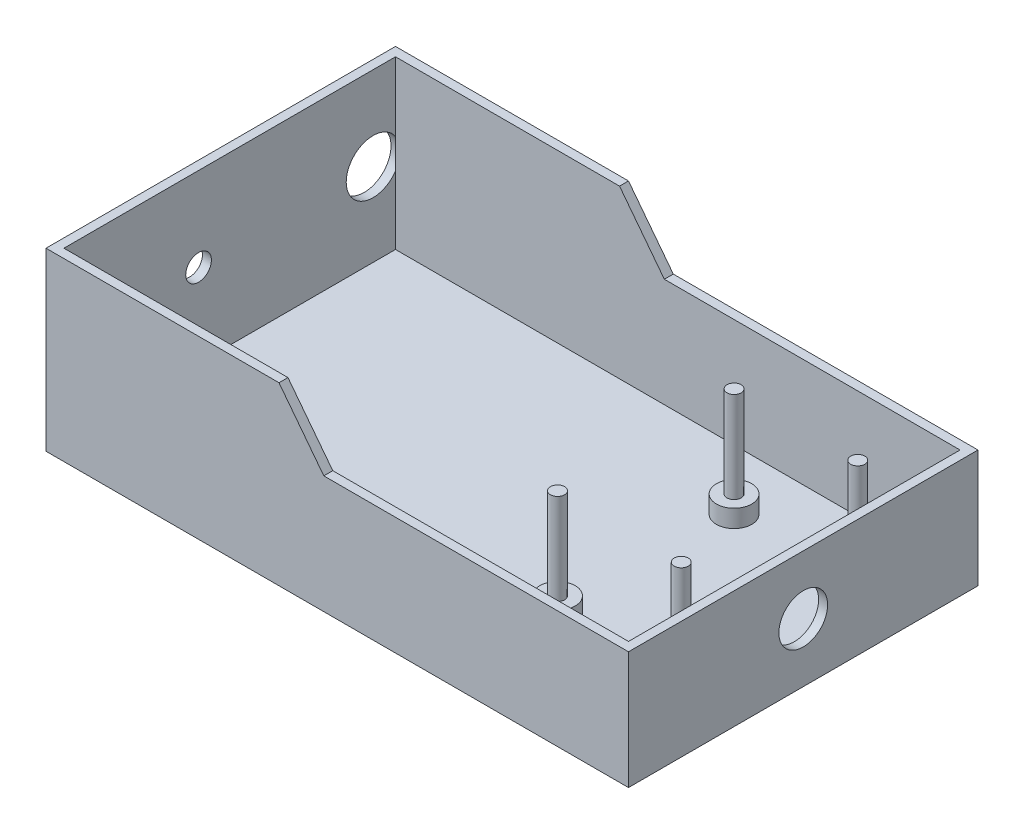
ISO-10303-21;
HEADER;
FILE_DESCRIPTION(('STEP AP214'),'2;1');
FILE_NAME('part.step','',(''),(''),'','','');
FILE_SCHEMA(('AUTOMOTIVE_DESIGN { 1 0 10303 214 1 1 1 1 }'));
ENDSEC;
DATA;
#1=APPLICATION_CONTEXT('core data for automotive mechanical design processes');
#2=APPLICATION_PROTOCOL_DEFINITION('international standard','automotive_design',2000,#1);
#3=PRODUCT_CONTEXT('',#1,'mechanical');
#4=PRODUCT('Part','Part','',(#3));
#5=PRODUCT_RELATED_PRODUCT_CATEGORY('part','',(#4));
#6=PRODUCT_DEFINITION_FORMATION('','',#4);
#7=PRODUCT_DEFINITION_CONTEXT('part definition',#1,'design');
#8=PRODUCT_DEFINITION('design','',#6,#7);
#9=PRODUCT_DEFINITION_SHAPE('','',#8);
#10=(LENGTH_UNIT() NAMED_UNIT(*) SI_UNIT(.MILLI.,.METRE.));
#11=(NAMED_UNIT(*) PLANE_ANGLE_UNIT() SI_UNIT($,.RADIAN.));
#12=(NAMED_UNIT(*) SI_UNIT($,.STERADIAN.) SOLID_ANGLE_UNIT());
#13=UNCERTAINTY_MEASURE_WITH_UNIT(LENGTH_MEASURE(1.E-05),#10,'distance_accuracy_value','');
#14=(GEOMETRIC_REPRESENTATION_CONTEXT(3) GLOBAL_UNCERTAINTY_ASSIGNED_CONTEXT((#13)) GLOBAL_UNIT_ASSIGNED_CONTEXT((#10,
#11,#12)) REPRESENTATION_CONTEXT('',''));
#15=CARTESIAN_POINT('',(0.,0.,0.));
#16=DIRECTION('',(0.,0.,1.));
#17=DIRECTION('',(1.,0.,0.));
#18=AXIS2_PLACEMENT_3D('',#15,#16,#17);
#19=CARTESIAN_POINT('',(0.,0.,2.54));
#20=DIRECTION('',(0.,0.,-1.));
#21=DIRECTION('',(-1.,0.,0.));
#22=AXIS2_PLACEMENT_3D('',#19,#20,#21);
#23=PLANE('',#22);
#24=DIRECTION('',(1.,0.,0.));
#25=VECTOR('',#24,1.);
#26=CARTESIAN_POINT('',(152.4,0.,2.54));
#27=LINE('',#26,#25);
#28=CARTESIAN_POINT('',(0.,0.,2.54));
#29=VERTEX_POINT('',#28);
#30=CARTESIAN_POINT('',(160.02,0.,2.53999999999997));
#31=VERTEX_POINT('',#30);
#32=EDGE_CURVE('E303',#29,#31,#27,.T.);
#33=ORIENTED_EDGE('',*,*,#32,.T.);
#34=DIRECTION('',(0.,-1.,0.));
#35=VECTOR('',#34,1.);
#36=CARTESIAN_POINT('',(160.02,30.7975,2.53999999999997));
#37=LINE('',#36,#35);
#38=CARTESIAN_POINT('',(160.02,30.7975,2.53999999999997));
#39=VERTEX_POINT('',#38);
#40=EDGE_CURVE('E253',#39,#31,#37,.T.);
#41=ORIENTED_EDGE('',*,*,#40,.F.);
#42=DIRECTION('',(1.,0.,0.));
#43=VECTOR('',#42,1.);
#44=CARTESIAN_POINT('',(152.4,30.7975,2.53999999999997));
#45=LINE('',#44,#43);
#46=CARTESIAN_POINT('',(76.2,30.7975,2.53999999999997));
#47=VERTEX_POINT('',#46);
#48=EDGE_CURVE('E287',#47,#39,#45,.T.);
#49=ORIENTED_EDGE('',*,*,#48,.F.);
#50=DIRECTION('',(0.609710760849693,-0.7926239891046,0.));
#51=VECTOR('',#50,1.);
#52=CARTESIAN_POINT('',(76.2,30.7975,2.53999999999997));
#53=LINE('',#52,#51);
#54=CARTESIAN_POINT('',(63.5,47.3075,2.53999999999997));
#55=VERTEX_POINT('',#54);
#56=EDGE_CURVE('E283',#55,#47,#53,.T.);
#57=ORIENTED_EDGE('',*,*,#56,.F.);
#58=DIRECTION('',(1.,0.,0.));
#59=VECTOR('',#58,1.);
#60=CARTESIAN_POINT('',(0.,47.3075,2.53999999999997));
#61=LINE('',#60,#59);
#62=CARTESIAN_POINT('',(0.,47.3075,2.53999999999998));
#63=VERTEX_POINT('',#62);
#64=EDGE_CURVE('E280',#63,#55,#61,.T.);
#65=ORIENTED_EDGE('',*,*,#64,.F.);
#66=DIRECTION('',(0.,-1.,0.));
#67=VECTOR('',#66,1.);
#68=CARTESIAN_POINT('',(0.,0.,2.54));
#69=LINE('',#68,#67);
#70=CARTESIAN_POINT('',(0.,27.7305974918157,2.54));
#71=VERTEX_POINT('',#70);
#72=EDGE_CURVE('E150',#63,#71,#69,.T.);
#73=ORIENTED_EDGE('',*,*,#72,.T.);
#74=CARTESIAN_POINT('',(0.,19.3063705243129,2.54));
#75=VERTEX_POINT('',#74);
#76=EDGE_CURVE('E142',#71,#75,#69,.T.);
#77=ORIENTED_EDGE('',*,*,#76,.T.);
#78=EDGE_CURVE('E60',#75,#29,#69,.T.);
#79=ORIENTED_EDGE('',*,*,#78,.T.);
#80=EDGE_LOOP('',(#33,#41,#49,#57,#65,#73,#77,#79));
#81=FACE_BOUND('',#80,.T.);
#82=ADVANCED_FACE('F38',(#81),#23,.F.);
#83=CARTESIAN_POINT('',(0.,0.,96.52));
#84=DIRECTION('',(0.,0.,-1.));
#85=DIRECTION('',(-1.,0.,0.));
#86=AXIS2_PLACEMENT_3D('',#83,#84,#85);
#87=PLANE('',#86);
#88=DIRECTION('',(0.,-1.,0.));
#89=VECTOR('',#88,1.);
#90=CARTESIAN_POINT('',(160.02,0.,96.52));
#91=LINE('',#90,#89);
#92=CARTESIAN_POINT('',(160.02,30.7975,96.52));
#93=VERTEX_POINT('',#92);
#94=CARTESIAN_POINT('',(160.02,0.,96.52));
#95=VERTEX_POINT('',#94);
#96=EDGE_CURVE('E255',#93,#95,#91,.T.);
#97=ORIENTED_EDGE('',*,*,#96,.T.);
#98=DIRECTION('',(-1.,0.,0.));
#99=VECTOR('',#98,1.);
#100=CARTESIAN_POINT('',(152.4,0.,96.52));
#101=LINE('',#100,#99);
#102=CARTESIAN_POINT('',(0.,0.,96.52));
#103=VERTEX_POINT('',#102);
#104=EDGE_CURVE('E306',#95,#103,#101,.T.);
#105=ORIENTED_EDGE('',*,*,#104,.T.);
#106=DIRECTION('',(0.,-1.,0.));
#107=VECTOR('',#106,1.);
#108=CARTESIAN_POINT('',(0.,0.,96.52));
#109=LINE('',#108,#107);
#110=CARTESIAN_POINT('',(0.,47.3075,96.52));
#111=VERTEX_POINT('',#110);
#112=EDGE_CURVE('E299',#111,#103,#109,.T.);
#113=ORIENTED_EDGE('',*,*,#112,.F.);
#114=DIRECTION('',(-1.,0.,0.));
#115=VECTOR('',#114,1.);
#116=CARTESIAN_POINT('',(0.,47.3075,96.52));
#117=LINE('',#116,#115);
#118=CARTESIAN_POINT('',(63.5,47.3075,96.52));
#119=VERTEX_POINT('',#118);
#120=EDGE_CURVE('E266',#119,#111,#117,.T.);
#121=ORIENTED_EDGE('',*,*,#120,.F.);
#122=DIRECTION('',(-0.609710760849693,0.7926239891046,0.));
#123=VECTOR('',#122,1.);
#124=CARTESIAN_POINT('',(63.5,47.3075,96.52));
#125=LINE('',#124,#123);
#126=CARTESIAN_POINT('',(76.2,30.7975,96.52));
#127=VERTEX_POINT('',#126);
#128=EDGE_CURVE('E262',#127,#119,#125,.T.);
#129=ORIENTED_EDGE('',*,*,#128,.F.);
#130=DIRECTION('',(-1.,0.,0.));
#131=VECTOR('',#130,1.);
#132=CARTESIAN_POINT('',(76.2,30.7975,96.52));
#133=LINE('',#132,#131);
#134=EDGE_CURVE('E259',#93,#127,#133,.T.);
#135=ORIENTED_EDGE('',*,*,#134,.F.);
#136=EDGE_LOOP('',(#97,#105,#113,#121,#129,#135));
#137=FACE_BOUND('',#136,.T.);
#138=ADVANCED_FACE('F343',(#137),#87,.T.);
#139=CARTESIAN_POINT('',(0.,0.,0.));
#140=DIRECTION('',(0.,0.,-1.));
#141=DIRECTION('',(-1.,0.,0.));
#142=AXIS2_PLACEMENT_3D('',#139,#140,#141);
#143=PLANE('',#142);
#144=DIRECTION('',(-1.,0.,0.));
#145=VECTOR('',#144,1.);
#146=CARTESIAN_POINT('',(152.4,-2.54,0.));
#147=LINE('',#146,#145);
#148=CARTESIAN_POINT('',(162.56,-2.54,0.));
#149=VERTEX_POINT('',#148);
#150=CARTESIAN_POINT('',(-2.54,-2.54,0.));
#151=VERTEX_POINT('',#150);
#152=EDGE_CURVE('E148',#149,#151,#147,.T.);
#153=ORIENTED_EDGE('',*,*,#152,.T.);
#154=DIRECTION('',(0.,-1.,0.));
#155=VECTOR('',#154,1.);
#156=CARTESIAN_POINT('',(-2.54,47.3075,0.));
#157=LINE('',#156,#155);
#158=CARTESIAN_POINT('',(-2.54,47.3075,0.));
#159=VERTEX_POINT('',#158);
#160=EDGE_CURVE('E222',#159,#151,#157,.T.);
#161=ORIENTED_EDGE('',*,*,#160,.F.);
#162=DIRECTION('',(1.,0.,0.));
#163=VECTOR('',#162,1.);
#164=CARTESIAN_POINT('',(0.,47.3075,0.));
#165=LINE('',#164,#163);
#166=CARTESIAN_POINT('',(63.5,47.3075,0.));
#167=VERTEX_POINT('',#166);
#168=EDGE_CURVE('E278',#159,#167,#165,.T.);
#169=ORIENTED_EDGE('',*,*,#168,.T.);
#170=DIRECTION('',(0.609710760849693,-0.7926239891046,0.));
#171=VECTOR('',#170,1.);
#172=CARTESIAN_POINT('',(76.2,30.7975,0.));
#173=LINE('',#172,#171);
#174=CARTESIAN_POINT('',(76.2,30.7975,0.));
#175=VERTEX_POINT('',#174);
#176=EDGE_CURVE('E293',#167,#175,#173,.T.);
#177=ORIENTED_EDGE('',*,*,#176,.T.);
#178=DIRECTION('',(1.,0.,0.));
#179=VECTOR('',#178,1.);
#180=CARTESIAN_POINT('',(152.4,30.7975,0.));
#181=LINE('',#180,#179);
#182=CARTESIAN_POINT('',(162.56,30.7975,0.));
#183=VERTEX_POINT('',#182);
#184=EDGE_CURVE('E284',#175,#183,#181,.T.);
#185=ORIENTED_EDGE('',*,*,#184,.T.);
#186=DIRECTION('',(0.,-1.,0.));
#187=VECTOR('',#186,1.);
#188=CARTESIAN_POINT('',(162.56,30.7975,0.));
#189=LINE('',#188,#187);
#190=EDGE_CURVE('E237',#183,#149,#189,.T.);
#191=ORIENTED_EDGE('',*,*,#190,.T.);
#192=EDGE_LOOP('',(#153,#161,#169,#177,#185,#191));
#193=FACE_BOUND('',#192,.T.);
#194=ADVANCED_FACE('F40',(#193),#143,.T.);
#195=CARTESIAN_POINT('',(152.4,-2.54,0.));
#196=DIRECTION('',(0.,1.,0.));
#197=DIRECTION('',(0.,0.,1.));
#198=AXIS2_PLACEMENT_3D('',#195,#196,#197);
#199=PLANE('',#198);
#200=ORIENTED_EDGE('',*,*,#152,.F.);
#201=DIRECTION('',(0.,0.,1.));
#202=VECTOR('',#201,1.);
#203=CARTESIAN_POINT('',(162.56,-2.54,0.));
#204=LINE('',#203,#202);
#205=CARTESIAN_POINT('',(162.56,-2.54,99.06));
#206=VERTEX_POINT('',#205);
#207=EDGE_CURVE('E240',#149,#206,#204,.T.);
#208=ORIENTED_EDGE('',*,*,#207,.T.);
#209=DIRECTION('',(1.,0.,0.));
#210=VECTOR('',#209,1.);
#211=CARTESIAN_POINT('',(152.4,-2.54,99.06));
#212=LINE('',#211,#210);
#213=CARTESIAN_POINT('',(-2.54,-2.54,99.06));
#214=VERTEX_POINT('',#213);
#215=EDGE_CURVE('E301',#214,#206,#212,.T.);
#216=ORIENTED_EDGE('',*,*,#215,.F.);
#217=DIRECTION('',(0.,0.,1.));
#218=VECTOR('',#217,1.);
#219=CARTESIAN_POINT('',(-2.54,-2.54,0.));
#220=LINE('',#219,#218);
#221=EDGE_CURVE('E225',#151,#214,#220,.T.);
#222=ORIENTED_EDGE('',*,*,#221,.F.);
#223=EDGE_LOOP('',(#200,#208,#216,#222));
#224=FACE_BOUND('',#223,.T.);
#225=ADVANCED_FACE('F314',(#224),#199,.F.);
#226=CARTESIAN_POINT('',(0.,0.,0.));
#227=DIRECTION('',(0.,-1.,0.));
#228=DIRECTION('',(0.,0.,-1.));
#229=AXIS2_PLACEMENT_3D('',#226,#227,#228);
#230=PLANE('',#229);
#231=CARTESIAN_POINT('',(148.02,0.,69.5782424781664));
#232=DIRECTION('',(0.,-1.,0.));
#233=DIRECTION('',(0.,0.,-1.));
#234=AXIS2_PLACEMENT_3D('',#231,#232,#233);
#235=CIRCLE('',#234,4.99999999999999);
#236=CARTESIAN_POINT('',(148.02,0.,64.5782424781664));
#237=VERTEX_POINT('',#236);
#238=EDGE_CURVE('E12',#237,#237,#235,.F.);
#239=ORIENTED_EDGE('',*,*,#238,.F.);
#240=EDGE_LOOP('',(#239));
#241=FACE_BOUND('',#240,.T.);
#242=CARTESIAN_POINT('',(112.968000000001,0.,69.5782424781664));
#243=DIRECTION('',(0.,-1.,0.));
#244=DIRECTION('',(0.,0.,-1.));
#245=AXIS2_PLACEMENT_3D('',#242,#243,#244);
#246=CIRCLE('',#245,5.00000000000001);
#247=CARTESIAN_POINT('',(112.968000000001,0.,64.5782424781664));
#248=VERTEX_POINT('',#247);
#249=EDGE_CURVE('E46',#248,#248,#246,.F.);
#250=ORIENTED_EDGE('',*,*,#249,.F.);
#251=EDGE_LOOP('',(#250));
#252=FACE_BOUND('',#251,.T.);
#253=CARTESIAN_POINT('',(148.02,0.,19.5402424781664));
#254=DIRECTION('',(0.,-1.,0.));
#255=DIRECTION('',(0.,0.,-1.));
#256=AXIS2_PLACEMENT_3D('',#253,#254,#255);
#257=CIRCLE('',#256,4.99999999999999);
#258=CARTESIAN_POINT('',(148.02,0.,14.5402424781664));
#259=VERTEX_POINT('',#258);
#260=EDGE_CURVE('E163',#259,#259,#257,.F.);
#261=ORIENTED_EDGE('',*,*,#260,.F.);
#262=EDGE_LOOP('',(#261));
#263=FACE_BOUND('',#262,.T.);
#264=CARTESIAN_POINT('',(112.968,0.,19.5402424781664));
#265=DIRECTION('',(0.,-1.,0.));
#266=DIRECTION('',(0.,0.,-1.));
#267=AXIS2_PLACEMENT_3D('',#264,#265,#266);
#268=CIRCLE('',#267,5.);
#269=CARTESIAN_POINT('',(112.968,0.,14.5402424781664));
#270=VERTEX_POINT('',#269);
#271=EDGE_CURVE('E152',#270,#270,#268,.F.);
#272=ORIENTED_EDGE('',*,*,#271,.F.);
#273=EDGE_LOOP('',(#272));
#274=FACE_BOUND('',#273,.T.);
#275=ORIENTED_EDGE('',*,*,#32,.F.);
#276=DIRECTION('',(0.,0.,-1.));
#277=VECTOR('',#276,1.);
#278=CARTESIAN_POINT('',(0.,0.,96.52));
#279=LINE('',#278,#277);
#280=EDGE_CURVE('E146',#103,#29,#279,.T.);
#281=ORIENTED_EDGE('',*,*,#280,.F.);
#282=ORIENTED_EDGE('',*,*,#104,.F.);
#283=DIRECTION('',(0.,0.,1.));
#284=VECTOR('',#283,1.);
#285=CARTESIAN_POINT('',(160.02,0.,96.52));
#286=LINE('',#285,#284);
#287=EDGE_CURVE('E246',#31,#95,#286,.T.);
#288=ORIENTED_EDGE('',*,*,#287,.F.);
#289=EDGE_LOOP('',(#275,#281,#282,#288));
#290=FACE_BOUND('',#289,.T.);
#291=ADVANCED_FACE('F347',(#241,#252,#263,#274,#290),#230,.F.);
#292=CARTESIAN_POINT('',(0.,0.,99.06));
#293=DIRECTION('',(0.,0.,-1.));
#294=DIRECTION('',(-1.,0.,0.));
#295=AXIS2_PLACEMENT_3D('',#292,#293,#294);
#296=PLANE('',#295);
#297=DIRECTION('',(-1.,0.,0.));
#298=VECTOR('',#297,1.);
#299=CARTESIAN_POINT('',(0.,47.3075,99.06));
#300=LINE('',#299,#298);
#301=CARTESIAN_POINT('',(63.5,47.3075,99.06));
#302=VERTEX_POINT('',#301);
#303=CARTESIAN_POINT('',(-2.54,47.3075,99.06));
#304=VERTEX_POINT('',#303);
#305=EDGE_CURVE('E263',#302,#304,#300,.T.);
#306=ORIENTED_EDGE('',*,*,#305,.T.);
#307=DIRECTION('',(0.,1.,0.));
#308=VECTOR('',#307,1.);
#309=CARTESIAN_POINT('',(-2.54,47.3075,99.06));
#310=LINE('',#309,#308);
#311=EDGE_CURVE('E228',#214,#304,#310,.T.);
#312=ORIENTED_EDGE('',*,*,#311,.F.);
#313=ORIENTED_EDGE('',*,*,#215,.T.);
#314=DIRECTION('',(0.,-1.,0.));
#315=VECTOR('',#314,1.);
#316=CARTESIAN_POINT('',(162.56,30.7975,99.06));
#317=LINE('',#316,#315);
#318=CARTESIAN_POINT('',(162.56,30.7975,99.06));
#319=VERTEX_POINT('',#318);
#320=EDGE_CURVE('E234',#319,#206,#317,.T.);
#321=ORIENTED_EDGE('',*,*,#320,.F.);
#322=DIRECTION('',(-1.,0.,0.));
#323=VECTOR('',#322,1.);
#324=CARTESIAN_POINT('',(76.2,30.7975,99.06));
#325=LINE('',#324,#323);
#326=CARTESIAN_POINT('',(76.2,30.7975,99.06));
#327=VERTEX_POINT('',#326);
#328=EDGE_CURVE('E258',#319,#327,#325,.T.);
#329=ORIENTED_EDGE('',*,*,#328,.T.);
#330=DIRECTION('',(-0.609710760849693,0.7926239891046,0.));
#331=VECTOR('',#330,1.);
#332=CARTESIAN_POINT('',(63.5,47.3075,99.06));
#333=LINE('',#332,#331);
#334=EDGE_CURVE('E272',#327,#302,#333,.T.);
#335=ORIENTED_EDGE('',*,*,#334,.T.);
#336=EDGE_LOOP('',(#306,#312,#313,#321,#329,#335));
#337=FACE_BOUND('',#336,.T.);
#338=ADVANCED_FACE('F335',(#337),#296,.F.);
#339=CARTESIAN_POINT('',(152.4,30.7975,2.53999999999997));
#340=DIRECTION('',(0.,1.,0.));
#341=DIRECTION('',(0.,0.,1.));
#342=AXIS2_PLACEMENT_3D('',#339,#340,#341);
#343=PLANE('',#342);
#344=ORIENTED_EDGE('',*,*,#184,.F.);
#345=DIRECTION('',(0.,0.,-1.));
#346=VECTOR('',#345,1.);
#347=CARTESIAN_POINT('',(76.2,30.7975,2.53999999999997));
#348=LINE('',#347,#346);
#349=EDGE_CURVE('E297',#47,#175,#348,.T.);
#350=ORIENTED_EDGE('',*,*,#349,.F.);
#351=ORIENTED_EDGE('',*,*,#48,.T.);
#352=DIRECTION('',(0.,0.,1.));
#353=VECTOR('',#352,1.);
#354=CARTESIAN_POINT('',(160.02,30.7975,0.));
#355=LINE('',#354,#353);
#356=EDGE_CURVE('E243',#39,#93,#355,.T.);
#357=ORIENTED_EDGE('',*,*,#356,.T.);
#358=ORIENTED_EDGE('',*,*,#134,.T.);
#359=DIRECTION('',(0.,0.,1.));
#360=VECTOR('',#359,1.);
#361=CARTESIAN_POINT('',(76.2,30.7975,96.52));
#362=LINE('',#361,#360);
#363=EDGE_CURVE('E269',#127,#327,#362,.T.);
#364=ORIENTED_EDGE('',*,*,#363,.T.);
#365=ORIENTED_EDGE('',*,*,#328,.F.);
#366=DIRECTION('',(0.,0.,1.));
#367=VECTOR('',#366,1.);
#368=CARTESIAN_POINT('',(162.56,30.7975,0.));
#369=LINE('',#368,#367);
#370=EDGE_CURVE('E247',#183,#319,#369,.T.);
#371=ORIENTED_EDGE('',*,*,#370,.F.);
#372=EDGE_LOOP('',(#344,#350,#351,#357,#358,#364,#365,#371));
#373=FACE_BOUND('',#372,.T.);
#374=ADVANCED_FACE('F330',(#373),#343,.T.);
#375=CARTESIAN_POINT('',(76.2,30.7975,2.53999999999997));
#376=DIRECTION('',(0.7926239891046,0.609710760849693,0.));
#377=DIRECTION('',(-0.609710760849693,0.7926239891046,0.));
#378=AXIS2_PLACEMENT_3D('',#375,#376,#377);
#379=PLANE('',#378);
#380=ORIENTED_EDGE('',*,*,#176,.F.);
#381=DIRECTION('',(0.,0.,-1.));
#382=VECTOR('',#381,1.);
#383=CARTESIAN_POINT('',(63.5,47.3075,2.53999999999997));
#384=LINE('',#383,#382);
#385=EDGE_CURVE('E290',#55,#167,#384,.T.);
#386=ORIENTED_EDGE('',*,*,#385,.F.);
#387=ORIENTED_EDGE('',*,*,#56,.T.);
#388=ORIENTED_EDGE('',*,*,#349,.T.);
#389=EDGE_LOOP('',(#380,#386,#387,#388));
#390=FACE_BOUND('',#389,.T.);
#391=ADVANCED_FACE('F326',(#390),#379,.T.);
#392=CARTESIAN_POINT('',(0.,47.3075,2.53999999999997));
#393=DIRECTION('',(0.,1.,0.));
#394=DIRECTION('',(-1.,0.,0.));
#395=AXIS2_PLACEMENT_3D('',#392,#393,#394);
#396=PLANE('',#395);
#397=ORIENTED_EDGE('',*,*,#168,.F.);
#398=DIRECTION('',(0.,0.,-1.));
#399=VECTOR('',#398,1.);
#400=CARTESIAN_POINT('',(-2.54,47.3075,0.));
#401=LINE('',#400,#399);
#402=EDGE_CURVE('E231',#304,#159,#401,.T.);
#403=ORIENTED_EDGE('',*,*,#402,.F.);
#404=ORIENTED_EDGE('',*,*,#305,.F.);
#405=DIRECTION('',(0.,0.,1.));
#406=VECTOR('',#405,1.);
#407=CARTESIAN_POINT('',(63.5,47.3075,96.52));
#408=LINE('',#407,#406);
#409=EDGE_CURVE('E276',#119,#302,#408,.T.);
#410=ORIENTED_EDGE('',*,*,#409,.F.);
#411=ORIENTED_EDGE('',*,*,#120,.T.);
#412=DIRECTION('',(0.,0.,-1.));
#413=VECTOR('',#412,1.);
#414=CARTESIAN_POINT('',(0.,47.3075,0.));
#415=LINE('',#414,#413);
#416=EDGE_CURVE('E219',#111,#63,#415,.T.);
#417=ORIENTED_EDGE('',*,*,#416,.T.);
#418=ORIENTED_EDGE('',*,*,#64,.T.);
#419=ORIENTED_EDGE('',*,*,#385,.T.);
#420=EDGE_LOOP('',(#397,#403,#404,#410,#411,#417,#418,#419));
#421=FACE_BOUND('',#420,.T.);
#422=ADVANCED_FACE('F321',(#421),#396,.T.);
#423=CARTESIAN_POINT('',(63.5,47.3075,96.52));
#424=DIRECTION('',(0.7926239891046,0.609710760849693,0.));
#425=DIRECTION('',(-0.609710760849693,0.7926239891046,0.));
#426=AXIS2_PLACEMENT_3D('',#423,#424,#425);
#427=PLANE('',#426);
#428=ORIENTED_EDGE('',*,*,#334,.F.);
#429=ORIENTED_EDGE('',*,*,#363,.F.);
#430=ORIENTED_EDGE('',*,*,#128,.T.);
#431=ORIENTED_EDGE('',*,*,#409,.T.);
#432=EDGE_LOOP('',(#428,#429,#430,#431));
#433=FACE_BOUND('',#432,.T.);
#434=ADVANCED_FACE('F338',(#433),#427,.T.);
#435=CARTESIAN_POINT('',(160.02,30.7975,0.));
#436=DIRECTION('',(-1.,0.,0.));
#437=DIRECTION('',(0.,0.,1.));
#438=AXIS2_PLACEMENT_3D('',#435,#436,#437);
#439=PLANE('',#438);
#440=CARTESIAN_POINT('',(160.02,14.12875,49.53));
#441=DIRECTION('',(1.,0.,0.));
#442=DIRECTION('',(0.,0.,-1.));
#443=AXIS2_PLACEMENT_3D('',#440,#441,#442);
#444=CIRCLE('',#443,6.90685485335124);
#445=CARTESIAN_POINT('',(160.02,14.12875,42.6231451466488));
#446=VERTEX_POINT('',#445);
#447=EDGE_CURVE('E203',#446,#446,#444,.T.);
#448=ORIENTED_EDGE('',*,*,#447,.T.);
#449=EDGE_LOOP('',(#448));
#450=FACE_BOUND('',#449,.T.);
#451=ORIENTED_EDGE('',*,*,#356,.F.);
#452=ORIENTED_EDGE('',*,*,#40,.T.);
#453=ORIENTED_EDGE('',*,*,#287,.T.);
#454=ORIENTED_EDGE('',*,*,#96,.F.);
#455=EDGE_LOOP('',(#451,#452,#453,#454));
#456=FACE_BOUND('',#455,.T.);
#457=ADVANCED_FACE('F351',(#450,#456),#439,.T.);
#458=CARTESIAN_POINT('',(162.56,30.7975,0.));
#459=DIRECTION('',(-1.,0.,0.));
#460=DIRECTION('',(0.,0.,1.));
#461=AXIS2_PLACEMENT_3D('',#458,#459,#460);
#462=PLANE('',#461);
#463=CARTESIAN_POINT('',(162.56,14.12875,49.53));
#464=DIRECTION('',(1.,0.,0.));
#465=DIRECTION('',(0.,0.,-1.));
#466=AXIS2_PLACEMENT_3D('',#463,#464,#465);
#467=CIRCLE('',#466,6.90685485335124);
#468=CARTESIAN_POINT('',(162.56,14.12875,42.6231451466488));
#469=VERTEX_POINT('',#468);
#470=EDGE_CURVE('E202',#469,#469,#467,.T.);
#471=ORIENTED_EDGE('',*,*,#470,.F.);
#472=EDGE_LOOP('',(#471));
#473=FACE_BOUND('',#472,.T.);
#474=ORIENTED_EDGE('',*,*,#320,.T.);
#475=ORIENTED_EDGE('',*,*,#207,.F.);
#476=ORIENTED_EDGE('',*,*,#190,.F.);
#477=ORIENTED_EDGE('',*,*,#370,.T.);
#478=EDGE_LOOP('',(#474,#475,#476,#477));
#479=FACE_BOUND('',#478,.T.);
#480=ADVANCED_FACE('F333',(#473,#479),#462,.F.);
#481=CARTESIAN_POINT('',(0.,0.,0.));
#482=DIRECTION('',(-1.,0.,0.));
#483=DIRECTION('',(0.,0.,1.));
#484=AXIS2_PLACEMENT_3D('',#481,#482,#483);
#485=PLANE('',#484);
#486=CARTESIAN_POINT('',(0.,23.5184840080643,78.9060770508605));
#487=DIRECTION('',(-1.,0.,0.));
#488=DIRECTION('',(0.,0.,1.));
#489=AXIS2_PLACEMENT_3D('',#486,#487,#488);
#490=CIRCLE('',#489,3.28556052629919);
#491=CARTESIAN_POINT('',(0.,23.5184840080643,82.1916375771597));
#492=VERTEX_POINT('',#491);
#493=EDGE_CURVE('E211',#492,#492,#490,.T.);
#494=ORIENTED_EDGE('',*,*,#493,.T.);
#495=EDGE_LOOP('',(#494));
#496=FACE_BOUND('',#495,.T.);
#497=CARTESIAN_POINT('',(0.,23.5184840080643,58.3586607582097));
#498=DIRECTION('',(-1.,0.,0.));
#499=DIRECTION('',(0.,0.,1.));
#500=AXIS2_PLACEMENT_3D('',#497,#498,#499);
#501=CIRCLE('',#500,3.63928193495785);
#502=CARTESIAN_POINT('',(0.,23.5184840080643,61.9979426931676));
#503=VERTEX_POINT('',#502);
#504=EDGE_CURVE('E216',#503,#503,#501,.T.);
#505=ORIENTED_EDGE('',*,*,#504,.T.);
#506=EDGE_LOOP('',(#505));
#507=FACE_BOUND('',#506,.T.);
#508=ORIENTED_EDGE('',*,*,#78,.F.);
#509=CARTESIAN_POINT('',(0.,23.5184840080643,8.89));
#510=DIRECTION('',(-1.,0.,0.));
#511=DIRECTION('',(0.,0.,1.));
#512=AXIS2_PLACEMENT_3D('',#509,#510,#511);
#513=CIRCLE('',#512,7.62);
#514=EDGE_CURVE('E133',#75,#71,#513,.T.);
#515=ORIENTED_EDGE('',*,*,#514,.T.);
#516=ORIENTED_EDGE('',*,*,#72,.F.);
#517=ORIENTED_EDGE('',*,*,#416,.F.);
#518=ORIENTED_EDGE('',*,*,#112,.T.);
#519=ORIENTED_EDGE('',*,*,#280,.T.);
#520=EDGE_LOOP('',(#508,#515,#516,#517,#518,#519));
#521=FACE_BOUND('',#520,.T.);
#522=ADVANCED_FACE('F144',(#496,#507,#521),#485,.F.);
#523=CARTESIAN_POINT('',(-2.54,0.,0.));
#524=DIRECTION('',(-1.,0.,0.));
#525=DIRECTION('',(0.,0.,1.));
#526=AXIS2_PLACEMENT_3D('',#523,#524,#525);
#527=PLANE('',#526);
#528=CARTESIAN_POINT('',(-2.54,23.5184840080643,78.9060770508605));
#529=DIRECTION('',(-1.,0.,0.));
#530=DIRECTION('',(0.,0.,1.));
#531=AXIS2_PLACEMENT_3D('',#528,#529,#530);
#532=CIRCLE('',#531,3.28556052629919);
#533=CARTESIAN_POINT('',(-2.54,23.5184840080643,82.1916375771597));
#534=VERTEX_POINT('',#533);
#535=EDGE_CURVE('E206',#534,#534,#532,.T.);
#536=ORIENTED_EDGE('',*,*,#535,.F.);
#537=EDGE_LOOP('',(#536));
#538=FACE_BOUND('',#537,.T.);
#539=CARTESIAN_POINT('',(-2.54,23.5184840080643,8.89));
#540=DIRECTION('',(-1.,0.,0.));
#541=DIRECTION('',(0.,0.,1.));
#542=AXIS2_PLACEMENT_3D('',#539,#540,#541);
#543=CIRCLE('',#542,7.62);
#544=CARTESIAN_POINT('',(-2.54,23.5184840080643,16.51));
#545=VERTEX_POINT('',#544);
#546=EDGE_CURVE('E138',#545,#545,#543,.T.);
#547=ORIENTED_EDGE('',*,*,#546,.F.);
#548=EDGE_LOOP('',(#547));
#549=FACE_BOUND('',#548,.T.);
#550=CARTESIAN_POINT('',(-2.54,23.5184840080643,58.3586607582097));
#551=DIRECTION('',(-1.,0.,0.));
#552=DIRECTION('',(0.,0.,1.));
#553=AXIS2_PLACEMENT_3D('',#550,#551,#552);
#554=CIRCLE('',#553,3.63928193495785);
#555=CARTESIAN_POINT('',(-2.54,23.5184840080643,61.9979426931676));
#556=VERTEX_POINT('',#555);
#557=EDGE_CURVE('E143',#556,#556,#554,.T.);
#558=ORIENTED_EDGE('',*,*,#557,.F.);
#559=EDGE_LOOP('',(#558));
#560=FACE_BOUND('',#559,.T.);
#561=ORIENTED_EDGE('',*,*,#160,.T.);
#562=ORIENTED_EDGE('',*,*,#221,.T.);
#563=ORIENTED_EDGE('',*,*,#311,.T.);
#564=ORIENTED_EDGE('',*,*,#402,.T.);
#565=EDGE_LOOP('',(#561,#562,#563,#564));
#566=FACE_BOUND('',#565,.T.);
#567=ADVANCED_FACE('F317',(#538,#549,#560,#566),#527,.T.);
#568=CARTESIAN_POINT('',(0.,23.5184840080643,58.3586607582097));
#569=DIRECTION('',(-1.,0.,0.));
#570=DIRECTION('',(0.,0.,1.));
#571=AXIS2_PLACEMENT_3D('',#568,#569,#570);
#572=CYLINDRICAL_SURFACE('',#571,3.63928193495785);
#573=ORIENTED_EDGE('',*,*,#504,.F.);
#574=EDGE_LOOP('',(#573));
#575=FACE_BOUND('',#574,.T.);
#576=ORIENTED_EDGE('',*,*,#557,.T.);
#577=EDGE_LOOP('',(#576));
#578=FACE_BOUND('',#577,.T.);
#579=ADVANCED_FACE('F481',(#575,#578),#572,.F.);
#580=CARTESIAN_POINT('',(0.,0.,0.));
#581=DIRECTION('',(-1.,0.,0.));
#582=DIRECTION('',(0.,0.,1.));
#583=AXIS2_PLACEMENT_3D('',#580,#581,#582);
#584=PLANE('',#583);
#585=ORIENTED_EDGE('',*,*,#76,.F.);
#586=EDGE_CURVE('E52',#71,#75,#513,.T.);
#587=ORIENTED_EDGE('',*,*,#586,.T.);
#588=EDGE_LOOP('',(#585,#587));
#589=FACE_BOUND('',#588,.T.);
#590=ADVANCED_FACE('F141',(#589),#584,.T.);
#591=CARTESIAN_POINT('',(0.,23.5184840080643,8.89));
#592=DIRECTION('',(-1.,0.,0.));
#593=DIRECTION('',(0.,0.,1.));
#594=AXIS2_PLACEMENT_3D('',#591,#592,#593);
#595=CYLINDRICAL_SURFACE('',#594,7.62);
#596=ORIENTED_EDGE('',*,*,#586,.F.);
#597=ORIENTED_EDGE('',*,*,#514,.F.);
#598=EDGE_LOOP('',(#596,#597));
#599=FACE_BOUND('',#598,.T.);
#600=ORIENTED_EDGE('',*,*,#546,.T.);
#601=EDGE_LOOP('',(#600));
#602=FACE_BOUND('',#601,.T.);
#603=ADVANCED_FACE('F134',(#599,#602),#595,.F.);
#604=CARTESIAN_POINT('',(0.,23.5184840080643,78.9060770508605));
#605=DIRECTION('',(-1.,0.,0.));
#606=DIRECTION('',(0.,0.,1.));
#607=AXIS2_PLACEMENT_3D('',#604,#605,#606);
#608=CYLINDRICAL_SURFACE('',#607,3.28556052629919);
#609=ORIENTED_EDGE('',*,*,#493,.F.);
#610=EDGE_LOOP('',(#609));
#611=FACE_BOUND('',#610,.T.);
#612=ORIENTED_EDGE('',*,*,#535,.T.);
#613=EDGE_LOOP('',(#612));
#614=FACE_BOUND('',#613,.T.);
#615=ADVANCED_FACE('F505',(#611,#614),#608,.F.);
#616=CARTESIAN_POINT('',(160.02,14.12875,49.53));
#617=DIRECTION('',(1.,0.,0.));
#618=DIRECTION('',(0.,0.,-1.));
#619=AXIS2_PLACEMENT_3D('',#616,#617,#618);
#620=CYLINDRICAL_SURFACE('',#619,6.90685485335124);
#621=ORIENTED_EDGE('',*,*,#447,.F.);
#622=EDGE_LOOP('',(#621));
#623=FACE_BOUND('',#622,.T.);
#624=ORIENTED_EDGE('',*,*,#470,.T.);
#625=EDGE_LOOP('',(#624));
#626=FACE_BOUND('',#625,.T.);
#627=ADVANCED_FACE('F513',(#623,#626),#620,.F.);
#628=CARTESIAN_POINT('',(112.968,5.,19.5402424781664));
#629=DIRECTION('',(0.,-1.,0.));
#630=DIRECTION('',(0.,0.,-1.));
#631=AXIS2_PLACEMENT_3D('',#628,#629,#630);
#632=CYLINDRICAL_SURFACE('',#631,5.);
#633=CARTESIAN_POINT('',(112.968,5.,19.5402424781664));
#634=DIRECTION('',(0.,1.,0.));
#635=DIRECTION('',(0.,0.,1.));
#636=AXIS2_PLACEMENT_3D('',#633,#634,#635);
#637=CIRCLE('',#636,5.);
#638=CARTESIAN_POINT('',(112.968,5.,24.5402424781664));
#639=VERTEX_POINT('',#638);
#640=EDGE_CURVE('E160',#639,#639,#637,.T.);
#641=ORIENTED_EDGE('',*,*,#640,.F.);
#642=EDGE_LOOP('',(#641));
#643=FACE_BOUND('',#642,.T.);
#644=ORIENTED_EDGE('',*,*,#271,.T.);
#645=EDGE_LOOP('',(#644));
#646=FACE_BOUND('',#645,.T.);
#647=ADVANCED_FACE('F522',(#643,#646),#632,.T.);
#648=CARTESIAN_POINT('',(112.968,5.,19.5402424781664));
#649=DIRECTION('',(0.,1.,0.));
#650=DIRECTION('',(0.,0.,1.));
#651=AXIS2_PLACEMENT_3D('',#648,#649,#650);
#652=PLANE('',#651);
#653=CARTESIAN_POINT('',(112.968,5.,19.5402424781664));
#654=DIRECTION('',(0.,1.,0.));
#655=DIRECTION('',(0.,0.,1.));
#656=AXIS2_PLACEMENT_3D('',#653,#654,#655);
#657=CIRCLE('',#656,2.);
#658=CARTESIAN_POINT('',(112.968,5.,21.5402424781664));
#659=VERTEX_POINT('',#658);
#660=EDGE_CURVE('E156',#659,#659,#657,.T.);
#661=ORIENTED_EDGE('',*,*,#660,.F.);
#662=EDGE_LOOP('',(#661));
#663=FACE_BOUND('',#662,.T.);
#664=ORIENTED_EDGE('',*,*,#640,.T.);
#665=EDGE_LOOP('',(#664));
#666=FACE_BOUND('',#665,.T.);
#667=ADVANCED_FACE('F543',(#663,#666),#652,.T.);
#668=CARTESIAN_POINT('',(152.4,30.7975,2.53999999999997));
#669=DIRECTION('',(0.,1.,0.));
#670=DIRECTION('',(0.,0.,1.));
#671=AXIS2_PLACEMENT_3D('',#668,#669,#670);
#672=PLANE('',#671);
#673=CARTESIAN_POINT('',(112.968,30.7975,19.5402424781664));
#674=DIRECTION('',(0.,1.,0.));
#675=DIRECTION('',(0.,0.,1.));
#676=AXIS2_PLACEMENT_3D('',#673,#674,#675);
#677=CIRCLE('',#676,2.);
#678=CARTESIAN_POINT('',(112.968,30.7975,21.5402424781664));
#679=VERTEX_POINT('',#678);
#680=EDGE_CURVE('E199',#679,#679,#677,.T.);
#681=ORIENTED_EDGE('',*,*,#680,.T.);
#682=EDGE_LOOP('',(#681));
#683=FACE_BOUND('',#682,.T.);
#684=ADVANCED_FACE('F535',(#683),#672,.T.);
#685=CARTESIAN_POINT('',(112.968,36.4543542494924,19.5402424781664));
#686=DIRECTION('',(0.,-1.,0.));
#687=DIRECTION('',(0.,0.,-1.));
#688=AXIS2_PLACEMENT_3D('',#685,#686,#687);
#689=CYLINDRICAL_SURFACE('',#688,2.);
#690=ORIENTED_EDGE('',*,*,#660,.T.);
#691=EDGE_LOOP('',(#690));
#692=FACE_BOUND('',#691,.T.);
#693=ORIENTED_EDGE('',*,*,#680,.F.);
#694=EDGE_LOOP('',(#693));
#695=FACE_BOUND('',#694,.T.);
#696=ADVANCED_FACE('F528',(#692,#695),#689,.T.);
#697=CARTESIAN_POINT('',(148.02,5.,19.5402424781664));
#698=DIRECTION('',(0.,-1.,0.));
#699=DIRECTION('',(0.,0.,-1.));
#700=AXIS2_PLACEMENT_3D('',#697,#698,#699);
#701=CYLINDRICAL_SURFACE('',#700,4.99999999999999);
#702=CARTESIAN_POINT('',(148.02,5.,19.5402424781664));
#703=DIRECTION('',(0.,1.,0.));
#704=DIRECTION('',(0.,0.,1.));
#705=AXIS2_PLACEMENT_3D('',#702,#703,#704);
#706=CIRCLE('',#705,4.99999999999999);
#707=CARTESIAN_POINT('',(148.02,5.,24.5402424781664));
#708=VERTEX_POINT('',#707);
#709=EDGE_CURVE('E167',#708,#708,#706,.T.);
#710=ORIENTED_EDGE('',*,*,#709,.F.);
#711=EDGE_LOOP('',(#710));
#712=FACE_BOUND('',#711,.T.);
#713=ORIENTED_EDGE('',*,*,#260,.T.);
#714=EDGE_LOOP('',(#713));
#715=FACE_BOUND('',#714,.T.);
#716=ADVANCED_FACE('F534',(#712,#715),#701,.T.);
#717=CARTESIAN_POINT('',(148.02,5.,19.5402424781664));
#718=DIRECTION('',(0.,1.,0.));
#719=DIRECTION('',(0.,0.,1.));
#720=AXIS2_PLACEMENT_3D('',#717,#718,#719);
#721=PLANE('',#720);
#722=CARTESIAN_POINT('',(148.02,5.,19.5402424781664));
#723=DIRECTION('',(0.,1.,0.));
#724=DIRECTION('',(0.,0.,1.));
#725=AXIS2_PLACEMENT_3D('',#722,#723,#724);
#726=CIRCLE('',#725,2.);
#727=CARTESIAN_POINT('',(148.02,5.,21.5402424781664));
#728=VERTEX_POINT('',#727);
#729=EDGE_CURVE('E164',#728,#728,#726,.T.);
#730=ORIENTED_EDGE('',*,*,#729,.F.);
#731=EDGE_LOOP('',(#730));
#732=FACE_BOUND('',#731,.T.);
#733=ORIENTED_EDGE('',*,*,#709,.T.);
#734=EDGE_LOOP('',(#733));
#735=FACE_BOUND('',#734,.T.);
#736=ADVANCED_FACE('F563',(#732,#735),#721,.T.);
#737=CARTESIAN_POINT('',(152.4,30.7975,2.53999999999997));
#738=DIRECTION('',(0.,1.,0.));
#739=DIRECTION('',(0.,0.,1.));
#740=AXIS2_PLACEMENT_3D('',#737,#738,#739);
#741=PLANE('',#740);
#742=CARTESIAN_POINT('',(148.02,30.7975,19.5402424781664));
#743=DIRECTION('',(0.,1.,0.));
#744=DIRECTION('',(0.,0.,1.));
#745=AXIS2_PLACEMENT_3D('',#742,#743,#744);
#746=CIRCLE('',#745,2.);
#747=CARTESIAN_POINT('',(148.02,30.7975,21.5402424781664));
#748=VERTEX_POINT('',#747);
#749=EDGE_CURVE('E196',#748,#748,#746,.T.);
#750=ORIENTED_EDGE('',*,*,#749,.T.);
#751=EDGE_LOOP('',(#750));
#752=FACE_BOUND('',#751,.T.);
#753=ADVANCED_FACE('F555',(#752),#741,.T.);
#754=CARTESIAN_POINT('',(148.02,36.4543542494924,19.5402424781664));
#755=DIRECTION('',(0.,-1.,0.));
#756=DIRECTION('',(0.,0.,-1.));
#757=AXIS2_PLACEMENT_3D('',#754,#755,#756);
#758=CYLINDRICAL_SURFACE('',#757,2.);
#759=ORIENTED_EDGE('',*,*,#729,.T.);
#760=EDGE_LOOP('',(#759));
#761=FACE_BOUND('',#760,.T.);
#762=ORIENTED_EDGE('',*,*,#749,.F.);
#763=EDGE_LOOP('',(#762));
#764=FACE_BOUND('',#763,.T.);
#765=ADVANCED_FACE('F548',(#761,#764),#758,.T.);
#766=CARTESIAN_POINT('',(112.968000000001,5.,69.5782424781664));
#767=DIRECTION('',(0.,-1.,0.));
#768=DIRECTION('',(0.,0.,-1.));
#769=AXIS2_PLACEMENT_3D('',#766,#767,#768);
#770=CYLINDRICAL_SURFACE('',#769,5.00000000000001);
#771=CARTESIAN_POINT('',(112.968000000001,5.,69.5782424781664));
#772=DIRECTION('',(0.,1.,0.));
#773=DIRECTION('',(0.,0.,1.));
#774=AXIS2_PLACEMENT_3D('',#771,#772,#773);
#775=CIRCLE('',#774,5.00000000000001);
#776=CARTESIAN_POINT('',(112.968000000001,5.,74.5782424781664));
#777=VERTEX_POINT('',#776);
#778=EDGE_CURVE('E173',#777,#777,#775,.T.);
#779=ORIENTED_EDGE('',*,*,#778,.F.);
#780=EDGE_LOOP('',(#779));
#781=FACE_BOUND('',#780,.T.);
#782=ORIENTED_EDGE('',*,*,#249,.T.);
#783=EDGE_LOOP('',(#782));
#784=FACE_BOUND('',#783,.T.);
#785=ADVANCED_FACE('F554',(#781,#784),#770,.T.);
#786=CARTESIAN_POINT('',(112.968000000001,5.,69.5782424781664));
#787=DIRECTION('',(0.,1.,0.));
#788=DIRECTION('',(0.,0.,1.));
#789=AXIS2_PLACEMENT_3D('',#786,#787,#788);
#790=PLANE('',#789);
#791=CARTESIAN_POINT('',(112.968000000001,5.,69.5782424781664));
#792=DIRECTION('',(0.,1.,0.));
#793=DIRECTION('',(0.,0.,1.));
#794=AXIS2_PLACEMENT_3D('',#791,#792,#793);
#795=CIRCLE('',#794,2.);
#796=CARTESIAN_POINT('',(112.968000000001,5.,71.5782424781664));
#797=VERTEX_POINT('',#796);
#798=EDGE_CURVE('E170',#797,#797,#795,.T.);
#799=ORIENTED_EDGE('',*,*,#798,.F.);
#800=EDGE_LOOP('',(#799));
#801=FACE_BOUND('',#800,.T.);
#802=ORIENTED_EDGE('',*,*,#778,.T.);
#803=EDGE_LOOP('',(#802));
#804=FACE_BOUND('',#803,.T.);
#805=ADVANCED_FACE('F583',(#801,#804),#790,.T.);
#806=CARTESIAN_POINT('',(152.4,30.7975,2.53999999999997));
#807=DIRECTION('',(0.,1.,0.));
#808=DIRECTION('',(0.,0.,1.));
#809=AXIS2_PLACEMENT_3D('',#806,#807,#808);
#810=PLANE('',#809);
#811=CARTESIAN_POINT('',(112.968000000001,30.7975,69.5782424781664));
#812=DIRECTION('',(0.,1.,0.));
#813=DIRECTION('',(0.,0.,1.));
#814=AXIS2_PLACEMENT_3D('',#811,#812,#813);
#815=CIRCLE('',#814,2.);
#816=CARTESIAN_POINT('',(112.968000000001,30.7975,71.5782424781664));
#817=VERTEX_POINT('',#816);
#818=EDGE_CURVE('E193',#817,#817,#815,.T.);
#819=ORIENTED_EDGE('',*,*,#818,.T.);
#820=EDGE_LOOP('',(#819));
#821=FACE_BOUND('',#820,.T.);
#822=ADVANCED_FACE('F575',(#821),#810,.T.);
#823=CARTESIAN_POINT('',(112.968000000001,36.4543542494924,69.5782424781664));
#824=DIRECTION('',(0.,-1.,0.));
#825=DIRECTION('',(0.,0.,-1.));
#826=AXIS2_PLACEMENT_3D('',#823,#824,#825);
#827=CYLINDRICAL_SURFACE('',#826,2.);
#828=ORIENTED_EDGE('',*,*,#798,.T.);
#829=EDGE_LOOP('',(#828));
#830=FACE_BOUND('',#829,.T.);
#831=ORIENTED_EDGE('',*,*,#818,.F.);
#832=EDGE_LOOP('',(#831));
#833=FACE_BOUND('',#832,.T.);
#834=ADVANCED_FACE('F568',(#830,#833),#827,.T.);
#835=CARTESIAN_POINT('',(148.02,5.,69.5782424781664));
#836=DIRECTION('',(0.,-1.,0.));
#837=DIRECTION('',(0.,0.,-1.));
#838=AXIS2_PLACEMENT_3D('',#835,#836,#837);
#839=CYLINDRICAL_SURFACE('',#838,4.99999999999999);
#840=CARTESIAN_POINT('',(148.02,5.,69.5782424781664));
#841=DIRECTION('',(0.,1.,0.));
#842=DIRECTION('',(0.,0.,1.));
#843=AXIS2_PLACEMENT_3D('',#840,#841,#842);
#844=CIRCLE('',#843,4.99999999999999);
#845=CARTESIAN_POINT('',(148.02,5.,74.5782424781664));
#846=VERTEX_POINT('',#845);
#847=EDGE_CURVE('E177',#846,#846,#844,.T.);
#848=ORIENTED_EDGE('',*,*,#847,.F.);
#849=EDGE_LOOP('',(#848));
#850=FACE_BOUND('',#849,.T.);
#851=ORIENTED_EDGE('',*,*,#238,.T.);
#852=EDGE_LOOP('',(#851));
#853=FACE_BOUND('',#852,.T.);
#854=ADVANCED_FACE('F574',(#850,#853),#839,.T.);
#855=CARTESIAN_POINT('',(148.02,5.,69.5782424781664));
#856=DIRECTION('',(0.,1.,0.));
#857=DIRECTION('',(0.,0.,1.));
#858=AXIS2_PLACEMENT_3D('',#855,#856,#857);
#859=PLANE('',#858);
#860=CARTESIAN_POINT('',(148.02,5.,69.5782424781664));
#861=DIRECTION('',(0.,1.,0.));
#862=DIRECTION('',(0.,0.,1.));
#863=AXIS2_PLACEMENT_3D('',#860,#861,#862);
#864=CIRCLE('',#863,2.);
#865=CARTESIAN_POINT('',(148.02,5.,71.5782424781664));
#866=VERTEX_POINT('',#865);
#867=EDGE_CURVE('E175',#866,#866,#864,.T.);
#868=ORIENTED_EDGE('',*,*,#867,.F.);
#869=EDGE_LOOP('',(#868));
#870=FACE_BOUND('',#869,.T.);
#871=ORIENTED_EDGE('',*,*,#847,.T.);
#872=EDGE_LOOP('',(#871));
#873=FACE_BOUND('',#872,.T.);
#874=ADVANCED_FACE('F601',(#870,#873),#859,.T.);
#875=CARTESIAN_POINT('',(152.4,30.7975,2.53999999999997));
#876=DIRECTION('',(0.,1.,0.));
#877=DIRECTION('',(0.,0.,1.));
#878=AXIS2_PLACEMENT_3D('',#875,#876,#877);
#879=PLANE('',#878);
#880=CARTESIAN_POINT('',(148.02,30.7975,69.5782424781664));
#881=DIRECTION('',(0.,1.,0.));
#882=DIRECTION('',(0.,0.,1.));
#883=AXIS2_PLACEMENT_3D('',#880,#881,#882);
#884=CIRCLE('',#883,2.);
#885=CARTESIAN_POINT('',(148.02,30.7975,71.5782424781664));
#886=VERTEX_POINT('',#885);
#887=EDGE_CURVE('E159',#886,#886,#884,.T.);
#888=ORIENTED_EDGE('',*,*,#887,.T.);
#889=EDGE_LOOP('',(#888));
#890=FACE_BOUND('',#889,.T.);
#891=ADVANCED_FACE('F594',(#890),#879,.T.);
#892=CARTESIAN_POINT('',(148.02,36.4543542494924,69.5782424781664));
#893=DIRECTION('',(0.,-1.,0.));
#894=DIRECTION('',(0.,0.,-1.));
#895=AXIS2_PLACEMENT_3D('',#892,#893,#894);
#896=CYLINDRICAL_SURFACE('',#895,2.);
#897=ORIENTED_EDGE('',*,*,#867,.T.);
#898=EDGE_LOOP('',(#897));
#899=FACE_BOUND('',#898,.T.);
#900=ORIENTED_EDGE('',*,*,#887,.F.);
#901=EDGE_LOOP('',(#900));
#902=FACE_BOUND('',#901,.T.);
#903=ADVANCED_FACE('F588',(#899,#902),#896,.T.);
#904=CLOSED_SHELL('',(#82,#138,#194,#225,#291,#338,#374,#391,#422,#434,#457,#480,#522,#567,#579,
#590,#603,#615,#627,#647,#667,#684,#696,#716,#736,#753,#765,#785,#805,#822,#834,#854,#874,#891,#903));
#905=MANIFOLD_SOLID_BREP('B2',#904);
#906=ADVANCED_BREP_SHAPE_REPRESENTATION('',(#18,#905),#14);
#907=SHAPE_DEFINITION_REPRESENTATION(#9,#906);
ENDSEC;
END-ISO-10303-21;
